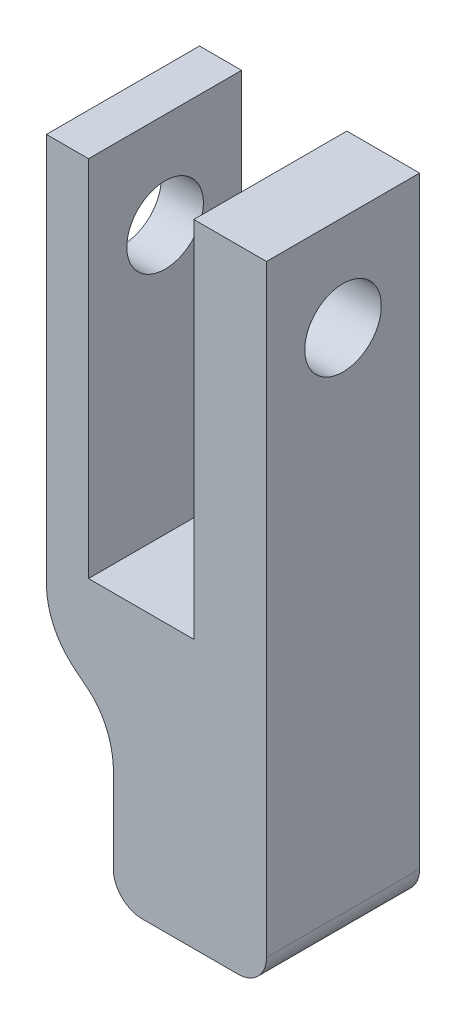
ISO-10303-21;
HEADER;
FILE_DESCRIPTION(('STEP AP214'),'2;1');
FILE_NAME('part.step','',(''),(''),'','','');
FILE_SCHEMA(('AUTOMOTIVE_DESIGN { 1 0 10303 214 1 1 1 1 }'));
ENDSEC;
DATA;
#1=APPLICATION_CONTEXT('core data for automotive mechanical design processes');
#2=APPLICATION_PROTOCOL_DEFINITION('international standard','automotive_design',2000,#1);
#3=PRODUCT_CONTEXT('',#1,'mechanical');
#4=PRODUCT('Part','Part','',(#3));
#5=PRODUCT_RELATED_PRODUCT_CATEGORY('part','',(#4));
#6=PRODUCT_DEFINITION_FORMATION('','',#4);
#7=PRODUCT_DEFINITION_CONTEXT('part definition',#1,'design');
#8=PRODUCT_DEFINITION('design','',#6,#7);
#9=PRODUCT_DEFINITION_SHAPE('','',#8);
#10=(LENGTH_UNIT() NAMED_UNIT(*) SI_UNIT(.MILLI.,.METRE.));
#11=(NAMED_UNIT(*) PLANE_ANGLE_UNIT() SI_UNIT($,.RADIAN.));
#12=(NAMED_UNIT(*) SI_UNIT($,.STERADIAN.) SOLID_ANGLE_UNIT());
#13=UNCERTAINTY_MEASURE_WITH_UNIT(LENGTH_MEASURE(1.E-05),#10,'distance_accuracy_value','');
#14=(GEOMETRIC_REPRESENTATION_CONTEXT(3) GLOBAL_UNCERTAINTY_ASSIGNED_CONTEXT((#13)) GLOBAL_UNIT_ASSIGNED_CONTEXT((#10,
#11,#12)) REPRESENTATION_CONTEXT('',''));
#15=CARTESIAN_POINT('',(0.,0.,0.));
#16=DIRECTION('',(0.,0.,1.));
#17=DIRECTION('',(1.,0.,0.));
#18=AXIS2_PLACEMENT_3D('',#15,#16,#17);
#19=CARTESIAN_POINT('',(0.973991401073067,8.25245940425572,4.));
#20=DIRECTION('',(0.,-1.,0.));
#21=DIRECTION('',(0.,0.,-1.));
#22=AXIS2_PLACEMENT_3D('',#19,#20,#21);
#23=PLANE('',#22);
#24=DIRECTION('',(-1.,0.,0.));
#25=VECTOR('',#24,1.);
#26=CARTESIAN_POINT('',(0.973991401073067,8.25245940425572,0.));
#27=LINE('',#26,#25);
#28=CARTESIAN_POINT('',(2.87399146663818,8.25245940425572,0.));
#29=VERTEX_POINT('',#28);
#30=CARTESIAN_POINT('',(0.973991401073067,8.25245940425572,0.));
#31=VERTEX_POINT('',#30);
#32=EDGE_CURVE('E247',#29,#31,#27,.T.);
#33=ORIENTED_EDGE('',*,*,#32,.T.);
#34=DIRECTION('',(0.,0.,-1.));
#35=VECTOR('',#34,1.);
#36=CARTESIAN_POINT('',(0.973991401073067,8.25245940425572,4.));
#37=LINE('',#36,#35);
#38=CARTESIAN_POINT('',(0.973991401073067,8.25245940425572,4.));
#39=VERTEX_POINT('',#38);
#40=EDGE_CURVE('E11',#39,#31,#37,.T.);
#41=ORIENTED_EDGE('',*,*,#40,.F.);
#42=DIRECTION('',(-1.,0.,0.));
#43=VECTOR('',#42,1.);
#44=CARTESIAN_POINT('',(0.973991401073067,8.25245940425572,4.));
#45=LINE('',#44,#43);
#46=CARTESIAN_POINT('',(2.87399146663818,8.25245940425572,4.));
#47=VERTEX_POINT('',#46);
#48=EDGE_CURVE('E300',#47,#39,#45,.T.);
#49=ORIENTED_EDGE('',*,*,#48,.F.);
#50=DIRECTION('',(0.,0.,-1.));
#51=VECTOR('',#50,1.);
#52=CARTESIAN_POINT('',(2.87399146663818,8.25245940425572,4.));
#53=LINE('',#52,#51);
#54=EDGE_CURVE('E160',#47,#29,#53,.T.);
#55=ORIENTED_EDGE('',*,*,#54,.T.);
#56=EDGE_LOOP('',(#33,#41,#49,#55));
#57=FACE_BOUND('',#56,.T.);
#58=ADVANCED_FACE('F38',(#57),#23,.F.);
#59=CARTESIAN_POINT('',(0.973991401073067,-1.24754059574428,4.));
#60=DIRECTION('',(1.,0.,0.));
#61=DIRECTION('',(0.,0.,-1.));
#62=AXIS2_PLACEMENT_3D('',#59,#60,#61);
#63=PLANE('',#62);
#64=CARTESIAN_POINT('',(0.973991401073068,5.75245940425572,2.));
#65=DIRECTION('',(1.,0.,0.));
#66=DIRECTION('',(0.,0.,-1.));
#67=AXIS2_PLACEMENT_3D('',#64,#65,#66);
#68=CIRCLE('',#67,1.);
#69=CARTESIAN_POINT('',(0.973991401073068,5.75245940425572,1.));
#70=VERTEX_POINT('',#69);
#71=EDGE_CURVE('E236',#70,#70,#68,.T.);
#72=ORIENTED_EDGE('',*,*,#71,.T.);
#73=EDGE_LOOP('',(#72));
#74=FACE_BOUND('',#73,.T.);
#75=DIRECTION('',(0.,-1.,0.));
#76=VECTOR('',#75,1.);
#77=CARTESIAN_POINT('',(0.973991401073067,-1.24754059574428,0.));
#78=LINE('',#77,#76);
#79=CARTESIAN_POINT('',(0.973991401073067,-1.24754059574428,0.));
#80=VERTEX_POINT('',#79);
#81=EDGE_CURVE('E237',#31,#80,#78,.T.);
#82=ORIENTED_EDGE('',*,*,#81,.T.);
#83=DIRECTION('',(0.,0.,-1.));
#84=VECTOR('',#83,1.);
#85=CARTESIAN_POINT('',(0.973991401073067,-1.24754059574428,4.));
#86=LINE('',#85,#84);
#87=CARTESIAN_POINT('',(0.973991401073067,-1.24754059574428,4.));
#88=VERTEX_POINT('',#87);
#89=EDGE_CURVE('E48',#88,#80,#86,.T.);
#90=ORIENTED_EDGE('',*,*,#89,.F.);
#91=DIRECTION('',(0.,-1.,0.));
#92=VECTOR('',#91,1.);
#93=CARTESIAN_POINT('',(0.973991401073067,-1.24754059574428,4.));
#94=LINE('',#93,#92);
#95=EDGE_CURVE('E111',#39,#88,#94,.T.);
#96=ORIENTED_EDGE('',*,*,#95,.F.);
#97=ORIENTED_EDGE('',*,*,#40,.T.);
#98=EDGE_LOOP('',(#82,#90,#96,#97));
#99=FACE_BOUND('',#98,.T.);
#100=ADVANCED_FACE('F225',(#74,#99),#63,.F.);
#101=CARTESIAN_POINT('',(-1.77600859892693,-1.24754059574428,4.));
#102=DIRECTION('',(0.,-1.,0.));
#103=DIRECTION('',(0.,0.,-1.));
#104=AXIS2_PLACEMENT_3D('',#101,#102,#103);
#105=PLANE('',#104);
#106=DIRECTION('',(-1.,0.,0.));
#107=VECTOR('',#106,1.);
#108=CARTESIAN_POINT('',(-1.77600859892693,-1.24754059574428,0.));
#109=LINE('',#108,#107);
#110=CARTESIAN_POINT('',(-1.77600859892693,-1.24754059574428,0.));
#111=VERTEX_POINT('',#110);
#112=EDGE_CURVE('E246',#80,#111,#109,.T.);
#113=ORIENTED_EDGE('',*,*,#112,.T.);
#114=DIRECTION('',(0.,0.,-1.));
#115=VECTOR('',#114,1.);
#116=CARTESIAN_POINT('',(-1.77600859892693,-1.24754059574428,4.));
#117=LINE('',#116,#115);
#118=CARTESIAN_POINT('',(-1.77600859892693,-1.24754059574428,4.));
#119=VERTEX_POINT('',#118);
#120=EDGE_CURVE('E253',#119,#111,#117,.T.);
#121=ORIENTED_EDGE('',*,*,#120,.F.);
#122=DIRECTION('',(-1.,0.,0.));
#123=VECTOR('',#122,1.);
#124=CARTESIAN_POINT('',(-1.77600859892693,-1.24754059574428,4.));
#125=LINE('',#124,#123);
#126=EDGE_CURVE('E251',#88,#119,#125,.T.);
#127=ORIENTED_EDGE('',*,*,#126,.F.);
#128=ORIENTED_EDGE('',*,*,#89,.T.);
#129=EDGE_LOOP('',(#113,#121,#127,#128));
#130=FACE_BOUND('',#129,.T.);
#131=ADVANCED_FACE('F222',(#130),#105,.F.);
#132=CARTESIAN_POINT('',(-1.77600859892693,8.25245940425572,4.));
#133=DIRECTION('',(-1.,0.,0.));
#134=DIRECTION('',(0.,0.,1.));
#135=AXIS2_PLACEMENT_3D('',#132,#133,#134);
#136=PLANE('',#135);
#137=CARTESIAN_POINT('',(-1.77600859892693,5.75245940425572,2.));
#138=DIRECTION('',(-1.,0.,0.));
#139=DIRECTION('',(0.,0.,1.));
#140=AXIS2_PLACEMENT_3D('',#137,#138,#139);
#141=CIRCLE('',#140,1.);
#142=CARTESIAN_POINT('',(-1.77600859892693,5.75245940425572,3.));
#143=VERTEX_POINT('',#142);
#144=EDGE_CURVE('E346',#143,#143,#141,.T.);
#145=ORIENTED_EDGE('',*,*,#144,.T.);
#146=EDGE_LOOP('',(#145));
#147=FACE_BOUND('',#146,.T.);
#148=DIRECTION('',(0.,1.,0.));
#149=VECTOR('',#148,1.);
#150=CARTESIAN_POINT('',(-1.77600859892693,8.25245940425572,0.));
#151=LINE('',#150,#149);
#152=CARTESIAN_POINT('',(-1.77600859892693,8.25245940425572,0.));
#153=VERTEX_POINT('',#152);
#154=EDGE_CURVE('E258',#111,#153,#151,.T.);
#155=ORIENTED_EDGE('',*,*,#154,.T.);
#156=DIRECTION('',(0.,0.,-1.));
#157=VECTOR('',#156,1.);
#158=CARTESIAN_POINT('',(-1.77600859892693,8.25245940425572,4.));
#159=LINE('',#158,#157);
#160=CARTESIAN_POINT('',(-1.77600859892693,8.25245940425572,4.));
#161=VERTEX_POINT('',#160);
#162=EDGE_CURVE('E323',#161,#153,#159,.T.);
#163=ORIENTED_EDGE('',*,*,#162,.F.);
#164=DIRECTION('',(0.,1.,0.));
#165=VECTOR('',#164,1.);
#166=CARTESIAN_POINT('',(-1.77600859892693,8.25245940425572,4.));
#167=LINE('',#166,#165);
#168=EDGE_CURVE('E331',#119,#161,#167,.T.);
#169=ORIENTED_EDGE('',*,*,#168,.F.);
#170=ORIENTED_EDGE('',*,*,#120,.T.);
#171=EDGE_LOOP('',(#155,#163,#169,#170));
#172=FACE_BOUND('',#171,.T.);
#173=ADVANCED_FACE('F218',(#147,#172),#136,.F.);
#174=CARTESIAN_POINT('',(-2.8760085035595,8.25245940425572,4.));
#175=DIRECTION('',(0.,-1.,0.));
#176=DIRECTION('',(0.,0.,-1.));
#177=AXIS2_PLACEMENT_3D('',#174,#175,#176);
#178=PLANE('',#177);
#179=DIRECTION('',(-1.,0.,0.));
#180=VECTOR('',#179,1.);
#181=CARTESIAN_POINT('',(-2.8760085035595,8.25245940425572,0.));
#182=LINE('',#181,#180);
#183=CARTESIAN_POINT('',(-2.8760085035595,8.25245940425572,0.));
#184=VERTEX_POINT('',#183);
#185=EDGE_CURVE('E262',#153,#184,#182,.T.);
#186=ORIENTED_EDGE('',*,*,#185,.T.);
#187=DIRECTION('',(0.,0.,-1.));
#188=VECTOR('',#187,1.);
#189=CARTESIAN_POINT('',(-2.8760085035595,8.25245940425572,4.));
#190=LINE('',#189,#188);
#191=CARTESIAN_POINT('',(-2.8760085035595,8.25245940425572,4.));
#192=VERTEX_POINT('',#191);
#193=EDGE_CURVE('E319',#192,#184,#190,.T.);
#194=ORIENTED_EDGE('',*,*,#193,.F.);
#195=DIRECTION('',(-1.,0.,0.));
#196=VECTOR('',#195,1.);
#197=CARTESIAN_POINT('',(-2.8760085035595,8.25245940425572,4.));
#198=LINE('',#197,#196);
#199=EDGE_CURVE('E334',#161,#192,#198,.T.);
#200=ORIENTED_EDGE('',*,*,#199,.F.);
#201=ORIENTED_EDGE('',*,*,#162,.T.);
#202=EDGE_LOOP('',(#186,#194,#200,#201));
#203=FACE_BOUND('',#202,.T.);
#204=ADVANCED_FACE('F214',(#203),#178,.F.);
#205=CARTESIAN_POINT('',(-2.8760085035595,-1.92466509601893,4.));
#206=DIRECTION('',(1.,0.,0.));
#207=DIRECTION('',(0.,0.,-1.));
#208=AXIS2_PLACEMENT_3D('',#205,#206,#207);
#209=PLANE('',#208);
#210=CARTESIAN_POINT('',(-2.8760085035595,5.75245940425572,2.));
#211=DIRECTION('',(-1.,0.,0.));
#212=DIRECTION('',(0.,0.,1.));
#213=AXIS2_PLACEMENT_3D('',#210,#211,#212);
#214=CIRCLE('',#213,1.);
#215=CARTESIAN_POINT('',(-2.8760085035595,5.75245940425572,3.));
#216=VERTEX_POINT('',#215);
#217=EDGE_CURVE('E350',#216,#216,#214,.T.);
#218=ORIENTED_EDGE('',*,*,#217,.F.);
#219=EDGE_LOOP('',(#218));
#220=FACE_BOUND('',#219,.T.);
#221=DIRECTION('',(0.,-1.,0.));
#222=VECTOR('',#221,1.);
#223=CARTESIAN_POINT('',(-2.8760085035595,-1.92466509601893,0.));
#224=LINE('',#223,#222);
#225=CARTESIAN_POINT('',(-2.8760085035595,-1.92466509601893,0.));
#226=VERTEX_POINT('',#225);
#227=EDGE_CURVE('E267',#184,#226,#224,.T.);
#228=ORIENTED_EDGE('',*,*,#227,.T.);
#229=DIRECTION('',(0.,0.,-1.));
#230=VECTOR('',#229,1.);
#231=CARTESIAN_POINT('',(-2.8760085035595,-1.92466509601893,4.));
#232=LINE('',#231,#230);
#233=CARTESIAN_POINT('',(-2.8760085035595,-1.92466509601893,4.));
#234=VERTEX_POINT('',#233);
#235=EDGE_CURVE('E315',#234,#226,#232,.T.);
#236=ORIENTED_EDGE('',*,*,#235,.F.);
#237=DIRECTION('',(0.,-1.,0.));
#238=VECTOR('',#237,1.);
#239=CARTESIAN_POINT('',(-2.8760085035595,-1.92466509601893,4.));
#240=LINE('',#239,#238);
#241=EDGE_CURVE('E202',#192,#234,#240,.T.);
#242=ORIENTED_EDGE('',*,*,#241,.F.);
#243=ORIENTED_EDGE('',*,*,#193,.T.);
#244=EDGE_LOOP('',(#228,#236,#242,#243));
#245=FACE_BOUND('',#244,.T.);
#246=ADVANCED_FACE('F210',(#220,#245),#209,.F.);
#247=CARTESIAN_POINT('',(-2.8760085035595,-1.92466509601893,4.));
#248=CARTESIAN_POINT('',(-2.87638009058335,-2.34114070094372,4.));
#249=CARTESIAN_POINT('',(-2.68054430927679,-2.9605201383581,4.));
#250=CARTESIAN_POINT('',(-2.10399750786193,-3.5239814366677,4.));
#251=CARTESIAN_POINT('',(-1.37837120757096,-4.02376985041654,4.));
#252=CARTESIAN_POINT('',(-1.13659162985847,-4.75173519901583,4.));
#253=CARTESIAN_POINT('',(-1.1260085035595,-5.23185360691371,4.));
#254=B_SPLINE_CURVE_WITH_KNOTS('',3,(#247,#248,#249,#250,#251,#252,#253),.UNSPECIFIED.,.F.,.F.,
(4,1,1,1,4),(0.,0.323705540675591,0.470965302606312,0.618379773455906,1.),.UNSPECIFIED.);
#255=DIRECTION('',(0.,0.,-1.));
#256=VECTOR('',#255,1.);
#257=SURFACE_OF_LINEAR_EXTRUSION('',#254,#256);
#258=CARTESIAN_POINT('',(-2.8760085035595,-1.92466509601893,0.));
#259=CARTESIAN_POINT('',(-2.87638009058335,-2.34114070094372,0.));
#260=CARTESIAN_POINT('',(-2.68054430927679,-2.9605201383581,0.));
#261=CARTESIAN_POINT('',(-2.10399750786193,-3.5239814366677,0.));
#262=CARTESIAN_POINT('',(-1.37837120757096,-4.02376985041654,0.));
#263=CARTESIAN_POINT('',(-1.13659162985847,-4.75173519901583,0.));
#264=CARTESIAN_POINT('',(-1.1260085035595,-5.23185360691371,0.));
#265=B_SPLINE_CURVE_WITH_KNOTS('',3,(#258,#259,#260,#261,#262,#263,#264),.UNSPECIFIED.,.F.,.F.,
(4,1,1,1,4),(0.,0.323705540675591,0.470965302606312,0.618379773455906,1.),.UNSPECIFIED.);
#266=CARTESIAN_POINT('',(-1.1260085035595,-5.23185360691371,0.));
#267=VERTEX_POINT('',#266);
#268=EDGE_CURVE('E270',#226,#267,#265,.T.);
#269=ORIENTED_EDGE('',*,*,#268,.T.);
#270=DIRECTION('',(0.,0.,-1.));
#271=VECTOR('',#270,1.);
#272=CARTESIAN_POINT('',(-1.1260085035595,-5.23185360691371,4.));
#273=LINE('',#272,#271);
#274=CARTESIAN_POINT('',(-1.1260085035595,-5.23185360691371,4.));
#275=VERTEX_POINT('',#274);
#276=EDGE_CURVE('E311',#275,#267,#273,.T.);
#277=ORIENTED_EDGE('',*,*,#276,.F.);
#278=EDGE_CURVE('E196',#234,#275,#254,.T.);
#279=ORIENTED_EDGE('',*,*,#278,.F.);
#280=ORIENTED_EDGE('',*,*,#235,.T.);
#281=EDGE_LOOP('',(#269,#277,#279,#280));
#282=FACE_BOUND('',#281,.T.);
#283=ADVANCED_FACE('F207',(#282),#257,.F.);
#284=CARTESIAN_POINT('',(-1.1260085035595,-7.49754059574428,4.));
#285=DIRECTION('',(1.,0.,0.));
#286=DIRECTION('',(0.,0.,-1.));
#287=AXIS2_PLACEMENT_3D('',#284,#285,#286);
#288=PLANE('',#287);
#289=DIRECTION('',(0.,-1.,0.));
#290=VECTOR('',#289,1.);
#291=CARTESIAN_POINT('',(-1.1260085035595,-7.49754059574428,0.));
#292=LINE('',#291,#290);
#293=CARTESIAN_POINT('',(-1.1260085035595,-7.49754059574428,0.));
#294=VERTEX_POINT('',#293);
#295=EDGE_CURVE('E275',#267,#294,#292,.T.);
#296=ORIENTED_EDGE('',*,*,#295,.T.);
#297=DIRECTION('',(0.,0.,-1.));
#298=VECTOR('',#297,1.);
#299=CARTESIAN_POINT('',(-1.1260085035595,-7.49754059574428,4.));
#300=LINE('',#299,#298);
#301=CARTESIAN_POINT('',(-1.1260085035595,-7.49754059574428,4.));
#302=VERTEX_POINT('',#301);
#303=EDGE_CURVE('E307',#302,#294,#300,.T.);
#304=ORIENTED_EDGE('',*,*,#303,.F.);
#305=DIRECTION('',(0.,-1.,0.));
#306=VECTOR('',#305,1.);
#307=CARTESIAN_POINT('',(-1.1260085035595,-7.49754059574428,4.));
#308=LINE('',#307,#306);
#309=EDGE_CURVE('E190',#275,#302,#308,.T.);
#310=ORIENTED_EDGE('',*,*,#309,.F.);
#311=ORIENTED_EDGE('',*,*,#276,.T.);
#312=EDGE_LOOP('',(#296,#304,#310,#311));
#313=FACE_BOUND('',#312,.T.);
#314=ADVANCED_FACE('F182',(#313),#288,.F.);
#315=CARTESIAN_POINT('',(-1.1260085035595,-7.49754059574428,4.));
#316=CARTESIAN_POINT('',(-1.13584564959517,-7.90023720654084,4.));
#317=CARTESIAN_POINT('',(-0.77870546796126,-8.25737821276717,4.));
#318=CARTESIAN_POINT('',(-0.376008503559501,-8.24754059574428,4.));
#319=B_SPLINE_CURVE_WITH_KNOTS('',3,(#315,#316,#317,#318),.UNSPECIFIED.,.F.,.F.,(4,4),(0.,1.),.UNSPECIFIED.);
#320=DIRECTION('',(0.,0.,-1.));
#321=VECTOR('',#320,1.);
#322=SURFACE_OF_LINEAR_EXTRUSION('',#319,#321);
#323=CARTESIAN_POINT('',(-1.1260085035595,-7.49754059574428,0.));
#324=CARTESIAN_POINT('',(-1.13584564959517,-7.90023720654084,0.));
#325=CARTESIAN_POINT('',(-0.77870546796126,-8.25737821276717,0.));
#326=CARTESIAN_POINT('',(-0.376008503559501,-8.24754059574428,0.));
#327=B_SPLINE_CURVE_WITH_KNOTS('',3,(#323,#324,#325,#326),.UNSPECIFIED.,.F.,.F.,(4,4),(0.,1.),.UNSPECIFIED.);
#328=CARTESIAN_POINT('',(-0.376008503559501,-8.24754059574428,0.));
#329=VERTEX_POINT('',#328);
#330=EDGE_CURVE('E281',#294,#329,#327,.T.);
#331=ORIENTED_EDGE('',*,*,#330,.T.);
#332=DIRECTION('',(0.,0.,-1.));
#333=VECTOR('',#332,1.);
#334=CARTESIAN_POINT('',(-0.376008503559501,-8.24754059574428,4.));
#335=LINE('',#334,#333);
#336=CARTESIAN_POINT('',(-0.376008503559501,-8.24754059574428,4.));
#337=VERTEX_POINT('',#336);
#338=EDGE_CURVE('E153',#337,#329,#335,.T.);
#339=ORIENTED_EDGE('',*,*,#338,.F.);
#340=EDGE_CURVE('E142',#302,#337,#319,.T.);
#341=ORIENTED_EDGE('',*,*,#340,.F.);
#342=ORIENTED_EDGE('',*,*,#303,.T.);
#343=EDGE_LOOP('',(#331,#339,#341,#342));
#344=FACE_BOUND('',#343,.T.);
#345=ADVANCED_FACE('F178',(#344),#322,.F.);
#346=CARTESIAN_POINT('',(2.12399143683585,-8.24754059574428,4.));
#347=DIRECTION('',(0.,1.,0.));
#348=DIRECTION('',(0.,0.,1.));
#349=AXIS2_PLACEMENT_3D('',#346,#347,#348);
#350=PLANE('',#349);
#351=CARTESIAN_POINT('',(0.873991436835854,-8.24754059574428,2.));
#352=DIRECTION('',(0.,-1.,0.));
#353=DIRECTION('',(0.,0.,-1.));
#354=AXIS2_PLACEMENT_3D('',#351,#352,#353);
#355=CIRCLE('',#354,1.);
#356=CARTESIAN_POINT('',(0.873991436835854,-8.24754059574428,1.));
#357=VERTEX_POINT('',#356);
#358=EDGE_CURVE('E355',#357,#357,#355,.T.);
#359=ORIENTED_EDGE('',*,*,#358,.F.);
#360=EDGE_LOOP('',(#359));
#361=FACE_BOUND('',#360,.T.);
#362=DIRECTION('',(1.,0.,0.));
#363=VECTOR('',#362,1.);
#364=CARTESIAN_POINT('',(2.12399143683585,-8.24754059574428,0.));
#365=LINE('',#364,#363);
#366=CARTESIAN_POINT('',(2.12399143683585,-8.24754059574428,0.));
#367=VERTEX_POINT('',#366);
#368=EDGE_CURVE('E151',#329,#367,#365,.T.);
#369=ORIENTED_EDGE('',*,*,#368,.T.);
#370=DIRECTION('',(0.,0.,-1.));
#371=VECTOR('',#370,1.);
#372=CARTESIAN_POINT('',(2.12399143683585,-8.24754059574428,4.));
#373=LINE('',#372,#371);
#374=CARTESIAN_POINT('',(2.12399143683585,-8.24754059574428,4.));
#375=VERTEX_POINT('',#374);
#376=EDGE_CURVE('E148',#375,#367,#373,.T.);
#377=ORIENTED_EDGE('',*,*,#376,.F.);
#378=DIRECTION('',(1.,0.,0.));
#379=VECTOR('',#378,1.);
#380=CARTESIAN_POINT('',(2.12399143683585,-8.24754059574428,4.));
#381=LINE('',#380,#379);
#382=EDGE_CURVE('E136',#337,#375,#381,.T.);
#383=ORIENTED_EDGE('',*,*,#382,.F.);
#384=ORIENTED_EDGE('',*,*,#338,.T.);
#385=EDGE_LOOP('',(#369,#377,#383,#384));
#386=FACE_BOUND('',#385,.T.);
#387=ADVANCED_FACE('F149',(#361,#386),#350,.F.);
#388=CARTESIAN_POINT('',(2.12399143683585,-8.24754059574428,4.));
#389=CARTESIAN_POINT('',(2.30776446130845,-8.24865172384152,4.));
#390=CARTESIAN_POINT('',(2.69944785613642,-8.09667452268729,4.));
#391=CARTESIAN_POINT('',(2.87638009058335,-7.70338296623,4.));
#392=CARTESIAN_POINT('',(2.87399146663818,-7.49754059574428,4.));
#393=B_SPLINE_CURVE_WITH_KNOTS('',3,(#388,#389,#390,#391,#392),.UNSPECIFIED.,.F.,.F.,(4,1,4),
(0.,0.471298765621757,1.),.UNSPECIFIED.);
#394=DIRECTION('',(0.,0.,-1.));
#395=VECTOR('',#394,1.);
#396=SURFACE_OF_LINEAR_EXTRUSION('',#393,#395);
#397=CARTESIAN_POINT('',(2.12399143683585,-8.24754059574428,0.));
#398=CARTESIAN_POINT('',(2.30776446130845,-8.24865172384152,0.));
#399=CARTESIAN_POINT('',(2.69944785613642,-8.09667452268729,0.));
#400=CARTESIAN_POINT('',(2.87638009058335,-7.70338296623,0.));
#401=CARTESIAN_POINT('',(2.87399146663818,-7.49754059574428,0.));
#402=B_SPLINE_CURVE_WITH_KNOTS('',3,(#397,#398,#399,#400,#401),.UNSPECIFIED.,.F.,.F.,(4,1,4),
(0.,0.471298765621757,1.),.UNSPECIFIED.);
#403=CARTESIAN_POINT('',(2.87399146663818,-7.49754059574428,0.));
#404=VERTEX_POINT('',#403);
#405=EDGE_CURVE('E97',#367,#404,#402,.T.);
#406=ORIENTED_EDGE('',*,*,#405,.T.);
#407=DIRECTION('',(0.,0.,-1.));
#408=VECTOR('',#407,1.);
#409=CARTESIAN_POINT('',(2.87399146663818,-7.49754059574428,4.));
#410=LINE('',#409,#408);
#411=CARTESIAN_POINT('',(2.87399146663818,-7.49754059574428,4.));
#412=VERTEX_POINT('',#411);
#413=EDGE_CURVE('E154',#412,#404,#410,.T.);
#414=ORIENTED_EDGE('',*,*,#413,.F.);
#415=EDGE_CURVE('E140',#375,#412,#393,.T.);
#416=ORIENTED_EDGE('',*,*,#415,.F.);
#417=ORIENTED_EDGE('',*,*,#376,.T.);
#418=EDGE_LOOP('',(#406,#414,#416,#417));
#419=FACE_BOUND('',#418,.T.);
#420=ADVANCED_FACE('F156',(#419),#396,.F.);
#421=CARTESIAN_POINT('',(2.87399146663818,8.25245940425572,4.));
#422=DIRECTION('',(-1.,0.,0.));
#423=DIRECTION('',(0.,0.,1.));
#424=AXIS2_PLACEMENT_3D('',#421,#422,#423);
#425=PLANE('',#424);
#426=CARTESIAN_POINT('',(2.87399146663818,5.75245940425572,2.));
#427=DIRECTION('',(-1.,0.,0.));
#428=DIRECTION('',(0.,0.,1.));
#429=AXIS2_PLACEMENT_3D('',#426,#427,#428);
#430=CIRCLE('',#429,1.);
#431=CARTESIAN_POINT('',(2.87399146663818,5.75245940425572,3.));
#432=VERTEX_POINT('',#431);
#433=EDGE_CURVE('E41',#432,#432,#430,.T.);
#434=ORIENTED_EDGE('',*,*,#433,.T.);
#435=EDGE_LOOP('',(#434));
#436=FACE_BOUND('',#435,.T.);
#437=DIRECTION('',(0.,1.,0.));
#438=VECTOR('',#437,1.);
#439=CARTESIAN_POINT('',(2.87399146663818,8.25245940425572,0.));
#440=LINE('',#439,#438);
#441=EDGE_CURVE('E103',#404,#29,#440,.T.);
#442=ORIENTED_EDGE('',*,*,#441,.T.);
#443=ORIENTED_EDGE('',*,*,#54,.F.);
#444=DIRECTION('',(0.,1.,0.));
#445=VECTOR('',#444,1.);
#446=CARTESIAN_POINT('',(2.87399146663818,8.25245940425572,4.));
#447=LINE('',#446,#445);
#448=EDGE_CURVE('E56',#412,#47,#447,.T.);
#449=ORIENTED_EDGE('',*,*,#448,.F.);
#450=ORIENTED_EDGE('',*,*,#413,.T.);
#451=EDGE_LOOP('',(#442,#443,#449,#450));
#452=FACE_BOUND('',#451,.T.);
#453=ADVANCED_FACE('F174',(#436,#452),#425,.F.);
#454=CARTESIAN_POINT('',(2.65373740358073,-8.02833333123576,4.));
#455=DIRECTION('',(0.,0.,1.));
#456=DIRECTION('',(1.,0.,0.));
#457=AXIS2_PLACEMENT_3D('',#454,#455,#456);
#458=PLANE('',#457);
#459=ORIENTED_EDGE('',*,*,#48,.T.);
#460=ORIENTED_EDGE('',*,*,#95,.T.);
#461=ORIENTED_EDGE('',*,*,#126,.T.);
#462=ORIENTED_EDGE('',*,*,#168,.T.);
#463=ORIENTED_EDGE('',*,*,#199,.T.);
#464=ORIENTED_EDGE('',*,*,#241,.T.);
#465=ORIENTED_EDGE('',*,*,#278,.T.);
#466=ORIENTED_EDGE('',*,*,#309,.T.);
#467=ORIENTED_EDGE('',*,*,#340,.T.);
#468=ORIENTED_EDGE('',*,*,#382,.T.);
#469=ORIENTED_EDGE('',*,*,#415,.T.);
#470=ORIENTED_EDGE('',*,*,#448,.T.);
#471=EDGE_LOOP('',(#459,#460,#461,#462,#463,#464,#465,#466,#467,#468,#469,#470));
#472=FACE_BOUND('',#471,.T.);
#473=ADVANCED_FACE('F138',(#472),#458,.T.);
#474=CARTESIAN_POINT('',(2.65373740358073,-8.02833333123576,0.));
#475=DIRECTION('',(0.,0.,1.));
#476=DIRECTION('',(1.,0.,0.));
#477=AXIS2_PLACEMENT_3D('',#474,#475,#476);
#478=PLANE('',#477);
#479=ORIENTED_EDGE('',*,*,#32,.F.);
#480=ORIENTED_EDGE('',*,*,#441,.F.);
#481=ORIENTED_EDGE('',*,*,#405,.F.);
#482=ORIENTED_EDGE('',*,*,#368,.F.);
#483=ORIENTED_EDGE('',*,*,#330,.F.);
#484=ORIENTED_EDGE('',*,*,#295,.F.);
#485=ORIENTED_EDGE('',*,*,#268,.F.);
#486=ORIENTED_EDGE('',*,*,#227,.F.);
#487=ORIENTED_EDGE('',*,*,#185,.F.);
#488=ORIENTED_EDGE('',*,*,#154,.F.);
#489=ORIENTED_EDGE('',*,*,#112,.F.);
#490=ORIENTED_EDGE('',*,*,#81,.F.);
#491=EDGE_LOOP('',(#479,#480,#481,#482,#483,#484,#485,#486,#487,#488,#489,#490));
#492=FACE_BOUND('',#491,.T.);
#493=ADVANCED_FACE('F256',(#492),#478,.F.);
#494=CARTESIAN_POINT('',(7.1239914964405,5.75245940425572,2.));
#495=DIRECTION('',(-1.,0.,0.));
#496=DIRECTION('',(0.,0.,1.));
#497=AXIS2_PLACEMENT_3D('',#494,#495,#496);
#498=CYLINDRICAL_SURFACE('',#497,1.);
#499=ORIENTED_EDGE('',*,*,#433,.F.);
#500=EDGE_LOOP('',(#499));
#501=FACE_BOUND('',#500,.T.);
#502=ORIENTED_EDGE('',*,*,#71,.F.);
#503=EDGE_LOOP('',(#502));
#504=FACE_BOUND('',#503,.T.);
#505=ADVANCED_FACE('F376',(#501,#504),#498,.F.);
#506=ORIENTED_EDGE('',*,*,#217,.T.);
#507=EDGE_LOOP('',(#506));
#508=FACE_BOUND('',#507,.T.);
#509=ORIENTED_EDGE('',*,*,#144,.F.);
#510=EDGE_LOOP('',(#509));
#511=FACE_BOUND('',#510,.T.);
#512=ADVANCED_FACE('F368',(#508,#511),#498,.F.);
#513=CARTESIAN_POINT('',(0.873991436835854,-3.24754059574428,2.));
#514=DIRECTION('',(0.,-1.,0.));
#515=DIRECTION('',(0.,0.,-1.));
#516=AXIS2_PLACEMENT_3D('',#513,#514,#515);
#517=CYLINDRICAL_SURFACE('',#516,1.);
#518=CARTESIAN_POINT('',(0.873991436835854,-3.24754059574428,2.));
#519=DIRECTION('',(0.,-1.,0.));
#520=DIRECTION('',(0.,0.,-1.));
#521=AXIS2_PLACEMENT_3D('',#518,#519,#520);
#522=CIRCLE('',#521,1.);
#523=CARTESIAN_POINT('',(0.873991436835854,-3.24754059574428,1.));
#524=VERTEX_POINT('',#523);
#525=EDGE_CURVE('E354',#524,#524,#522,.T.);
#526=ORIENTED_EDGE('',*,*,#525,.F.);
#527=EDGE_LOOP('',(#526));
#528=FACE_BOUND('',#527,.T.);
#529=ORIENTED_EDGE('',*,*,#358,.T.);
#530=EDGE_LOOP('',(#529));
#531=FACE_BOUND('',#530,.T.);
#532=ADVANCED_FACE('F365',(#528,#531),#517,.F.);
#533=CARTESIAN_POINT('',(0.873991436835854,-3.24754059574428,2.));
#534=DIRECTION('',(0.,-1.,0.));
#535=DIRECTION('',(0.,0.,-1.));
#536=AXIS2_PLACEMENT_3D('',#533,#534,#535);
#537=PLANE('',#536);
#538=ORIENTED_EDGE('',*,*,#525,.T.);
#539=EDGE_LOOP('',(#538));
#540=FACE_BOUND('',#539,.T.);
#541=ADVANCED_FACE('F363',(#540),#537,.T.);
#542=CLOSED_SHELL('',(#58,#100,#131,#173,#204,#246,#283,#314,#345,#387,#420,#453,#473,#493,#505,
#512,#532,#541));
#543=MANIFOLD_SOLID_BREP('B2',#542);
#544=ADVANCED_BREP_SHAPE_REPRESENTATION('',(#18,#543),#14);
#545=SHAPE_DEFINITION_REPRESENTATION(#9,#544);
ENDSEC;
END-ISO-10303-21;
